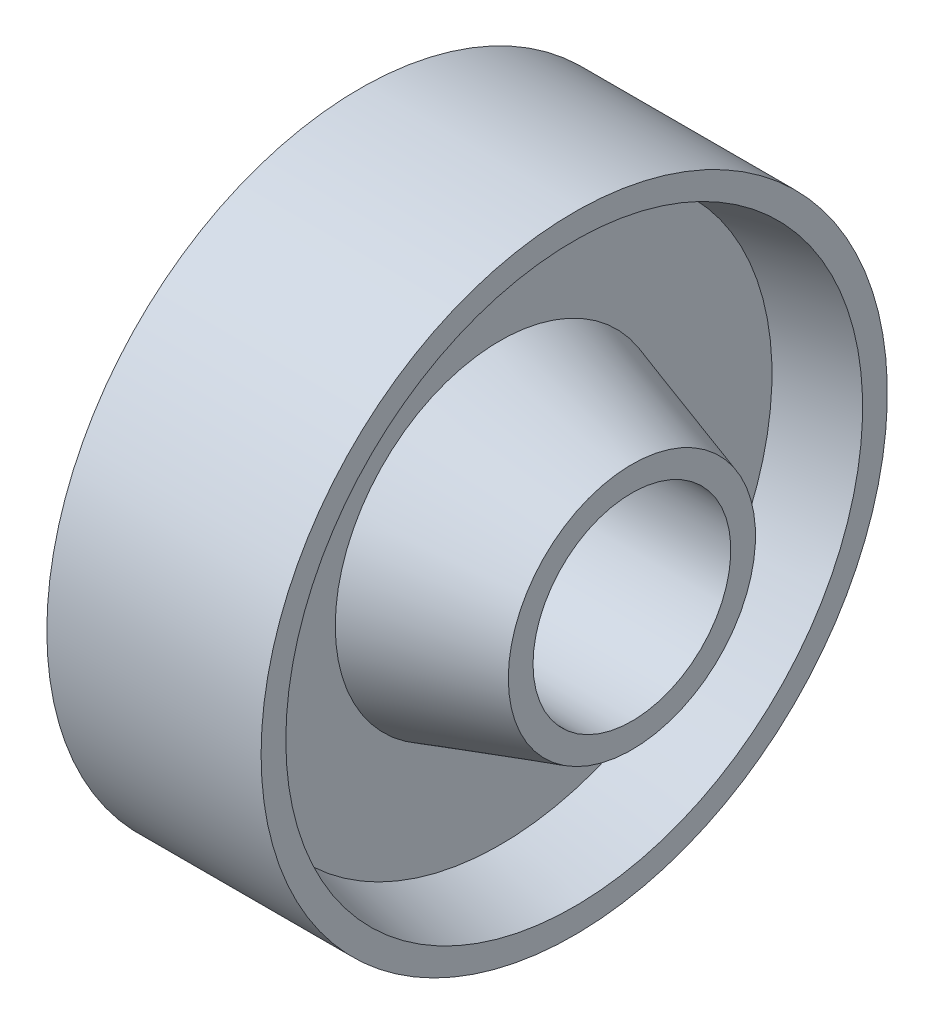
ISO-10303-21;
HEADER;
FILE_DESCRIPTION(('STEP AP214'),'2;1');
FILE_NAME('part.step','',(''),(''),'','','');
FILE_SCHEMA(('AUTOMOTIVE_DESIGN { 1 0 10303 214 1 1 1 1 }'));
ENDSEC;
DATA;
#1=APPLICATION_CONTEXT('core data for automotive mechanical design processes');
#2=APPLICATION_PROTOCOL_DEFINITION('international standard','automotive_design',2000,#1);
#3=PRODUCT_CONTEXT('',#1,'mechanical');
#4=PRODUCT('Part','Part','',(#3));
#5=PRODUCT_RELATED_PRODUCT_CATEGORY('part','',(#4));
#6=PRODUCT_DEFINITION_FORMATION('','',#4);
#7=PRODUCT_DEFINITION_CONTEXT('part definition',#1,'design');
#8=PRODUCT_DEFINITION('design','',#6,#7);
#9=PRODUCT_DEFINITION_SHAPE('','',#8);
#10=(LENGTH_UNIT() NAMED_UNIT(*) SI_UNIT(.MILLI.,.METRE.));
#11=(NAMED_UNIT(*) PLANE_ANGLE_UNIT() SI_UNIT($,.RADIAN.));
#12=(NAMED_UNIT(*) SI_UNIT($,.STERADIAN.) SOLID_ANGLE_UNIT());
#13=UNCERTAINTY_MEASURE_WITH_UNIT(LENGTH_MEASURE(1.E-05),#10,'distance_accuracy_value','');
#14=(GEOMETRIC_REPRESENTATION_CONTEXT(3) GLOBAL_UNCERTAINTY_ASSIGNED_CONTEXT((#13)) GLOBAL_UNIT_ASSIGNED_CONTEXT((#10,
#11,#12)) REPRESENTATION_CONTEXT('',''));
#15=CARTESIAN_POINT('',(0.,0.,0.));
#16=DIRECTION('',(0.,0.,1.));
#17=DIRECTION('',(1.,0.,0.));
#18=AXIS2_PLACEMENT_3D('',#15,#16,#17);
#19=CARTESIAN_POINT('',(20.,0.,0.));
#20=DIRECTION('',(-1.,0.,0.));
#21=DIRECTION('',(0.,0.,1.));
#22=AXIS2_PLACEMENT_3D('',#19,#20,#21);
#23=CONICAL_SURFACE('',#22,15.,0.302884868374971);
#24=CARTESIAN_POINT('',(4.,0.,0.));
#25=DIRECTION('',(-1.,0.,0.));
#26=DIRECTION('',(0.,0.,1.));
#27=AXIS2_PLACEMENT_3D('',#24,#25,#26);
#28=CIRCLE('',#27,20.);
#29=CARTESIAN_POINT('',(4.,0.,20.));
#30=VERTEX_POINT('',#29);
#31=EDGE_CURVE('E71',#30,#30,#28,.T.);
#32=ORIENTED_EDGE('',*,*,#31,.F.);
#33=EDGE_LOOP('',(#32));
#34=FACE_BOUND('',#33,.T.);
#35=CARTESIAN_POINT('',(20.,0.,0.));
#36=DIRECTION('',(-1.,0.,0.));
#37=DIRECTION('',(0.,0.,1.));
#38=AXIS2_PLACEMENT_3D('',#35,#36,#37);
#39=CIRCLE('',#38,15.);
#40=CARTESIAN_POINT('',(20.,0.,15.));
#41=VERTEX_POINT('',#40);
#42=EDGE_CURVE('E10',#41,#41,#39,.T.);
#43=ORIENTED_EDGE('',*,*,#42,.T.);
#44=EDGE_LOOP('',(#43));
#45=FACE_BOUND('',#44,.T.);
#46=ADVANCED_FACE('F31',(#34,#45),#23,.T.);
#47=CARTESIAN_POINT('',(20.,12.,0.));
#48=DIRECTION('',(-1.,0.,0.));
#49=DIRECTION('',(0.,0.,1.));
#50=AXIS2_PLACEMENT_3D('',#47,#48,#49);
#51=PLANE('',#50);
#52=ORIENTED_EDGE('',*,*,#42,.F.);
#53=EDGE_LOOP('',(#52));
#54=FACE_BOUND('',#53,.T.);
#55=CARTESIAN_POINT('',(20.,0.,0.));
#56=DIRECTION('',(-1.,0.,0.));
#57=DIRECTION('',(0.,0.,1.));
#58=AXIS2_PLACEMENT_3D('',#55,#56,#57);
#59=CIRCLE('',#58,12.);
#60=CARTESIAN_POINT('',(20.,0.,12.));
#61=VERTEX_POINT('',#60);
#62=EDGE_CURVE('E37',#61,#61,#59,.T.);
#63=ORIENTED_EDGE('',*,*,#62,.T.);
#64=EDGE_LOOP('',(#63));
#65=FACE_BOUND('',#64,.T.);
#66=ADVANCED_FACE('F78',(#54,#65),#51,.F.);
#67=CARTESIAN_POINT('',(0.,0.,0.));
#68=DIRECTION('',(-1.,0.,0.));
#69=DIRECTION('',(0.,0.,1.));
#70=AXIS2_PLACEMENT_3D('',#67,#68,#69);
#71=CYLINDRICAL_SURFACE('',#70,12.);
#72=ORIENTED_EDGE('',*,*,#62,.F.);
#73=EDGE_LOOP('',(#72));
#74=FACE_BOUND('',#73,.T.);
#75=CARTESIAN_POINT('',(-20.,0.,0.));
#76=DIRECTION('',(-1.,0.,0.));
#77=DIRECTION('',(0.,0.,1.));
#78=AXIS2_PLACEMENT_3D('',#75,#76,#77);
#79=CIRCLE('',#78,12.);
#80=CARTESIAN_POINT('',(-20.,0.,12.));
#81=VERTEX_POINT('',#80);
#82=EDGE_CURVE('E41',#81,#81,#79,.T.);
#83=ORIENTED_EDGE('',*,*,#82,.T.);
#84=EDGE_LOOP('',(#83));
#85=FACE_BOUND('',#84,.T.);
#86=ADVANCED_FACE('F82',(#74,#85),#71,.F.);
#87=CARTESIAN_POINT('',(-20.,12.,0.));
#88=DIRECTION('',(1.,0.,0.));
#89=DIRECTION('',(0.,0.,-1.));
#90=AXIS2_PLACEMENT_3D('',#87,#88,#89);
#91=PLANE('',#90);
#92=ORIENTED_EDGE('',*,*,#82,.F.);
#93=EDGE_LOOP('',(#92));
#94=FACE_BOUND('',#93,.T.);
#95=CARTESIAN_POINT('',(-20.,0.,0.));
#96=DIRECTION('',(-1.,0.,0.));
#97=DIRECTION('',(0.,0.,1.));
#98=AXIS2_PLACEMENT_3D('',#95,#96,#97);
#99=CIRCLE('',#98,15.);
#100=CARTESIAN_POINT('',(-20.,0.,15.));
#101=VERTEX_POINT('',#100);
#102=EDGE_CURVE('E45',#101,#101,#99,.T.);
#103=ORIENTED_EDGE('',*,*,#102,.T.);
#104=EDGE_LOOP('',(#103));
#105=FACE_BOUND('',#104,.T.);
#106=ADVANCED_FACE('F87',(#94,#105),#91,.F.);
#107=CARTESIAN_POINT('',(-4.,0.,0.));
#108=DIRECTION('',(1.,0.,0.));
#109=DIRECTION('',(0.,0.,-1.));
#110=AXIS2_PLACEMENT_3D('',#107,#108,#109);
#111=CONICAL_SURFACE('',#110,20.,0.302884868374971);
#112=ORIENTED_EDGE('',*,*,#102,.F.);
#113=EDGE_LOOP('',(#112));
#114=FACE_BOUND('',#113,.T.);
#115=CARTESIAN_POINT('',(-4.,0.,0.));
#116=DIRECTION('',(-1.,0.,0.));
#117=DIRECTION('',(0.,0.,1.));
#118=AXIS2_PLACEMENT_3D('',#115,#116,#117);
#119=CIRCLE('',#118,20.);
#120=CARTESIAN_POINT('',(-4.,0.,20.));
#121=VERTEX_POINT('',#120);
#122=EDGE_CURVE('E50',#121,#121,#119,.T.);
#123=ORIENTED_EDGE('',*,*,#122,.T.);
#124=EDGE_LOOP('',(#123));
#125=FACE_BOUND('',#124,.T.);
#126=ADVANCED_FACE('F93',(#114,#125),#111,.T.);
#127=CARTESIAN_POINT('',(-4.,20.,0.));
#128=DIRECTION('',(1.,0.,0.));
#129=DIRECTION('',(0.,0.,-1.));
#130=AXIS2_PLACEMENT_3D('',#127,#128,#129);
#131=PLANE('',#130);
#132=ORIENTED_EDGE('',*,*,#122,.F.);
#133=EDGE_LOOP('',(#132));
#134=FACE_BOUND('',#133,.T.);
#135=CARTESIAN_POINT('',(-4.,0.,0.));
#136=DIRECTION('',(-1.,0.,0.));
#137=DIRECTION('',(0.,0.,1.));
#138=AXIS2_PLACEMENT_3D('',#135,#136,#137);
#139=CIRCLE('',#138,33.);
#140=CARTESIAN_POINT('',(-4.,0.,33.));
#141=VERTEX_POINT('',#140);
#142=EDGE_CURVE('E53',#141,#141,#139,.T.);
#143=ORIENTED_EDGE('',*,*,#142,.T.);
#144=EDGE_LOOP('',(#143));
#145=FACE_BOUND('',#144,.T.);
#146=ADVANCED_FACE('F97',(#134,#145),#131,.F.);
#147=CARTESIAN_POINT('',(-13.,0.,0.));
#148=DIRECTION('',(-1.,0.,0.));
#149=DIRECTION('',(0.,0.,1.));
#150=AXIS2_PLACEMENT_3D('',#147,#148,#149);
#151=CONICAL_SURFACE('',#150,35.,0.218668945873942);
#152=ORIENTED_EDGE('',*,*,#142,.F.);
#153=EDGE_LOOP('',(#152));
#154=FACE_BOUND('',#153,.T.);
#155=CARTESIAN_POINT('',(-13.,0.,0.));
#156=DIRECTION('',(-1.,0.,0.));
#157=DIRECTION('',(0.,0.,1.));
#158=AXIS2_PLACEMENT_3D('',#155,#156,#157);
#159=CIRCLE('',#158,35.);
#160=CARTESIAN_POINT('',(-13.,0.,35.));
#161=VERTEX_POINT('',#160);
#162=EDGE_CURVE('E56',#161,#161,#159,.T.);
#163=ORIENTED_EDGE('',*,*,#162,.T.);
#164=EDGE_LOOP('',(#163));
#165=FACE_BOUND('',#164,.T.);
#166=ADVANCED_FACE('F101',(#154,#165),#151,.F.);
#167=CARTESIAN_POINT('',(-13.,35.,0.));
#168=DIRECTION('',(1.,0.,0.));
#169=DIRECTION('',(0.,0.,-1.));
#170=AXIS2_PLACEMENT_3D('',#167,#168,#169);
#171=PLANE('',#170);
#172=ORIENTED_EDGE('',*,*,#162,.F.);
#173=EDGE_LOOP('',(#172));
#174=FACE_BOUND('',#173,.T.);
#175=CARTESIAN_POINT('',(-13.,0.,0.));
#176=DIRECTION('',(-1.,0.,0.));
#177=DIRECTION('',(0.,0.,1.));
#178=AXIS2_PLACEMENT_3D('',#175,#176,#177);
#179=CIRCLE('',#178,38.);
#180=CARTESIAN_POINT('',(-13.,0.,38.));
#181=VERTEX_POINT('',#180);
#182=EDGE_CURVE('E59',#181,#181,#179,.T.);
#183=ORIENTED_EDGE('',*,*,#182,.T.);
#184=EDGE_LOOP('',(#183));
#185=FACE_BOUND('',#184,.T.);
#186=ADVANCED_FACE('F105',(#174,#185),#171,.F.);
#187=CARTESIAN_POINT('',(0.,0.,0.));
#188=DIRECTION('',(-1.,0.,0.));
#189=DIRECTION('',(0.,0.,1.));
#190=AXIS2_PLACEMENT_3D('',#187,#188,#189);
#191=CYLINDRICAL_SURFACE('',#190,38.);
#192=ORIENTED_EDGE('',*,*,#182,.F.);
#193=EDGE_LOOP('',(#192));
#194=FACE_BOUND('',#193,.T.);
#195=CARTESIAN_POINT('',(13.,0.,0.));
#196=DIRECTION('',(-1.,0.,0.));
#197=DIRECTION('',(0.,0.,1.));
#198=AXIS2_PLACEMENT_3D('',#195,#196,#197);
#199=CIRCLE('',#198,38.);
#200=CARTESIAN_POINT('',(13.,0.,38.));
#201=VERTEX_POINT('',#200);
#202=EDGE_CURVE('E62',#201,#201,#199,.T.);
#203=ORIENTED_EDGE('',*,*,#202,.T.);
#204=EDGE_LOOP('',(#203));
#205=FACE_BOUND('',#204,.T.);
#206=ADVANCED_FACE('F109',(#194,#205),#191,.T.);
#207=CARTESIAN_POINT('',(13.,35.,0.));
#208=DIRECTION('',(-1.,0.,0.));
#209=DIRECTION('',(0.,0.,1.));
#210=AXIS2_PLACEMENT_3D('',#207,#208,#209);
#211=PLANE('',#210);
#212=ORIENTED_EDGE('',*,*,#202,.F.);
#213=EDGE_LOOP('',(#212));
#214=FACE_BOUND('',#213,.T.);
#215=CARTESIAN_POINT('',(13.,0.,0.));
#216=DIRECTION('',(-1.,0.,0.));
#217=DIRECTION('',(0.,0.,1.));
#218=AXIS2_PLACEMENT_3D('',#215,#216,#217);
#219=CIRCLE('',#218,35.);
#220=CARTESIAN_POINT('',(13.,0.,35.));
#221=VERTEX_POINT('',#220);
#222=EDGE_CURVE('E65',#221,#221,#219,.T.);
#223=ORIENTED_EDGE('',*,*,#222,.T.);
#224=EDGE_LOOP('',(#223));
#225=FACE_BOUND('',#224,.T.);
#226=ADVANCED_FACE('F113',(#214,#225),#211,.F.);
#227=CARTESIAN_POINT('',(4.,0.,0.));
#228=DIRECTION('',(1.,0.,0.));
#229=DIRECTION('',(0.,0.,-1.));
#230=AXIS2_PLACEMENT_3D('',#227,#228,#229);
#231=CONICAL_SURFACE('',#230,33.,0.218668945873942);
#232=ORIENTED_EDGE('',*,*,#222,.F.);
#233=EDGE_LOOP('',(#232));
#234=FACE_BOUND('',#233,.T.);
#235=CARTESIAN_POINT('',(4.,0.,0.));
#236=DIRECTION('',(-1.,0.,0.));
#237=DIRECTION('',(0.,0.,1.));
#238=AXIS2_PLACEMENT_3D('',#235,#236,#237);
#239=CIRCLE('',#238,33.);
#240=CARTESIAN_POINT('',(4.,0.,33.));
#241=VERTEX_POINT('',#240);
#242=EDGE_CURVE('E68',#241,#241,#239,.T.);
#243=ORIENTED_EDGE('',*,*,#242,.T.);
#244=EDGE_LOOP('',(#243));
#245=FACE_BOUND('',#244,.T.);
#246=ADVANCED_FACE('F117',(#234,#245),#231,.F.);
#247=CARTESIAN_POINT('',(4.,20.,0.));
#248=DIRECTION('',(-1.,0.,0.));
#249=DIRECTION('',(0.,0.,1.));
#250=AXIS2_PLACEMENT_3D('',#247,#248,#249);
#251=PLANE('',#250);
#252=ORIENTED_EDGE('',*,*,#242,.F.);
#253=EDGE_LOOP('',(#252));
#254=FACE_BOUND('',#253,.T.);
#255=ORIENTED_EDGE('',*,*,#31,.T.);
#256=EDGE_LOOP('',(#255));
#257=FACE_BOUND('',#256,.T.);
#258=ADVANCED_FACE('F75',(#254,#257),#251,.F.);
#259=CLOSED_SHELL('',(#46,#66,#86,#106,#126,#146,#166,#186,#206,#226,#246,#258));
#260=MANIFOLD_SOLID_BREP('B2',#259);
#261=ADVANCED_BREP_SHAPE_REPRESENTATION('',(#18,#260),#14);
#262=SHAPE_DEFINITION_REPRESENTATION(#9,#261);
ENDSEC;
END-ISO-10303-21;
